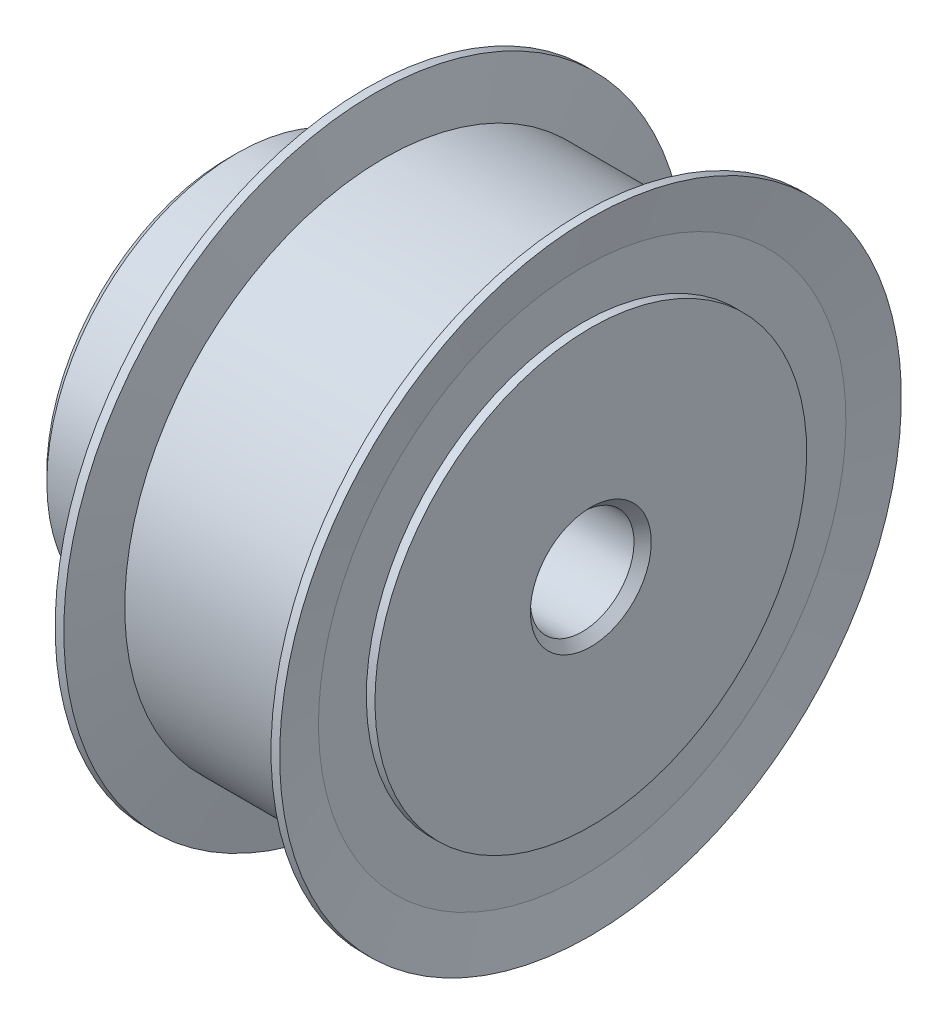
ISO-10303-21;
HEADER;
FILE_DESCRIPTION(('STEP AP214'),'2;1');
FILE_NAME('part.step','',(''),(''),'','','');
FILE_SCHEMA(('AUTOMOTIVE_DESIGN { 1 0 10303 214 1 1 1 1 }'));
ENDSEC;
DATA;
#1=APPLICATION_CONTEXT('core data for automotive mechanical design processes');
#2=APPLICATION_PROTOCOL_DEFINITION('international standard','automotive_design',2000,#1);
#3=PRODUCT_CONTEXT('',#1,'mechanical');
#4=PRODUCT('Part','Part','',(#3));
#5=PRODUCT_RELATED_PRODUCT_CATEGORY('part','',(#4));
#6=PRODUCT_DEFINITION_FORMATION('','',#4);
#7=PRODUCT_DEFINITION_CONTEXT('part definition',#1,'design');
#8=PRODUCT_DEFINITION('design','',#6,#7);
#9=PRODUCT_DEFINITION_SHAPE('','',#8);
#10=(LENGTH_UNIT() NAMED_UNIT(*) SI_UNIT(.MILLI.,.METRE.));
#11=(NAMED_UNIT(*) PLANE_ANGLE_UNIT() SI_UNIT($,.RADIAN.));
#12=(NAMED_UNIT(*) SI_UNIT($,.STERADIAN.) SOLID_ANGLE_UNIT());
#13=UNCERTAINTY_MEASURE_WITH_UNIT(LENGTH_MEASURE(1.E-05),#10,'distance_accuracy_value','');
#14=(GEOMETRIC_REPRESENTATION_CONTEXT(3) GLOBAL_UNCERTAINTY_ASSIGNED_CONTEXT((#13)) GLOBAL_UNIT_ASSIGNED_CONTEXT((#10,
#11,#12)) REPRESENTATION_CONTEXT('',''));
#15=CARTESIAN_POINT('',(0.,0.,0.));
#16=DIRECTION('',(0.,0.,1.));
#17=DIRECTION('',(1.,0.,0.));
#18=AXIS2_PLACEMENT_3D('',#15,#16,#17);
#19=CARTESIAN_POINT('',(21.,0.,0.));
#20=DIRECTION('',(1.,0.,0.));
#21=DIRECTION('',(0.,1.,0.));
#22=AXIS2_PLACEMENT_3D('',#19,#20,#21);
#23=CYLINDRICAL_SURFACE('',#22,11.);
#24=CARTESIAN_POINT('',(0.499999999999997,0.,0.));
#25=DIRECTION('',(-1.,0.,0.));
#26=DIRECTION('',(0.,-1.,0.));
#27=AXIS2_PLACEMENT_3D('',#24,#25,#26);
#28=CIRCLE('',#27,11.);
#29=CARTESIAN_POINT('',(0.499999999999997,-11.,0.));
#30=VERTEX_POINT('',#29);
#31=EDGE_CURVE('E10',#30,#30,#28,.F.);
#32=ORIENTED_EDGE('',*,*,#31,.T.);
#33=EDGE_LOOP('',(#32));
#34=FACE_BOUND('',#33,.T.);
#35=CARTESIAN_POINT('',(7.96237529878517,0.,0.));
#36=DIRECTION('',(1.,0.,0.));
#37=DIRECTION('',(0.,1.,0.));
#38=AXIS2_PLACEMENT_3D('',#35,#36,#37);
#39=CIRCLE('',#38,11.);
#40=CARTESIAN_POINT('',(7.96237529878517,11.,0.));
#41=VERTEX_POINT('',#40);
#42=EDGE_CURVE('E78',#41,#41,#39,.T.);
#43=ORIENTED_EDGE('',*,*,#42,.F.);
#44=EDGE_LOOP('',(#43));
#45=FACE_BOUND('',#44,.T.);
#46=ADVANCED_FACE('F45',(#34,#45),#23,.T.);
#47=CARTESIAN_POINT('',(7.96237529878517,12.5,0.));
#48=DIRECTION('',(-1.,0.,0.));
#49=DIRECTION('',(0.,-1.,0.));
#50=AXIS2_PLACEMENT_3D('',#47,#48,#49);
#51=PLANE('',#50);
#52=ORIENTED_EDGE('',*,*,#42,.T.);
#53=EDGE_LOOP('',(#52));
#54=FACE_BOUND('',#53,.T.);
#55=CARTESIAN_POINT('',(7.96237529878517,0.,0.));
#56=DIRECTION('',(1.,0.,0.));
#57=DIRECTION('',(0.,1.,0.));
#58=AXIS2_PLACEMENT_3D('',#55,#56,#57);
#59=CIRCLE('',#58,12.5);
#60=CARTESIAN_POINT('',(7.96237529878517,12.5,0.));
#61=VERTEX_POINT('',#60);
#62=EDGE_CURVE('E82',#61,#61,#59,.T.);
#63=ORIENTED_EDGE('',*,*,#62,.F.);
#64=EDGE_LOOP('',(#63));
#65=FACE_BOUND('',#64,.T.);
#66=ADVANCED_FACE('F149',(#54,#65),#51,.T.);
#67=CARTESIAN_POINT('',(21.,0.,0.));
#68=DIRECTION('',(1.,0.,0.));
#69=DIRECTION('',(0.,1.,0.));
#70=AXIS2_PLACEMENT_3D('',#67,#68,#69);
#71=CYLINDRICAL_SURFACE('',#70,12.5);
#72=ORIENTED_EDGE('',*,*,#62,.T.);
#73=EDGE_LOOP('',(#72));
#74=FACE_BOUND('',#73,.T.);
#75=CARTESIAN_POINT('',(8.46237529878517,0.,0.));
#76=DIRECTION('',(1.,0.,0.));
#77=DIRECTION('',(0.,1.,0.));
#78=AXIS2_PLACEMENT_3D('',#75,#76,#77);
#79=CIRCLE('',#78,12.5);
#80=CARTESIAN_POINT('',(8.46237529878517,12.5,0.));
#81=VERTEX_POINT('',#80);
#82=EDGE_CURVE('E86',#81,#81,#79,.T.);
#83=ORIENTED_EDGE('',*,*,#82,.F.);
#84=EDGE_LOOP('',(#83));
#85=FACE_BOUND('',#84,.T.);
#86=ADVANCED_FACE('F154',(#74,#85),#71,.T.);
#87=CARTESIAN_POINT('',(8.46237529878517,15.2710492321753,0.));
#88=DIRECTION('',(-1.,0.,0.));
#89=DIRECTION('',(0.,-1.,0.));
#90=AXIS2_PLACEMENT_3D('',#87,#88,#89);
#91=PLANE('',#90);
#92=ORIENTED_EDGE('',*,*,#82,.T.);
#93=EDGE_LOOP('',(#92));
#94=FACE_BOUND('',#93,.T.);
#95=CARTESIAN_POINT('',(8.46237529878517,0.,0.));
#96=DIRECTION('',(1.,0.,0.));
#97=DIRECTION('',(0.,1.,0.));
#98=AXIS2_PLACEMENT_3D('',#95,#96,#97);
#99=CIRCLE('',#98,15.2710492321753);
#100=CARTESIAN_POINT('',(8.46237529878517,15.2710492321753,0.));
#101=VERTEX_POINT('',#100);
#102=EDGE_CURVE('E90',#101,#101,#99,.T.);
#103=ORIENTED_EDGE('',*,*,#102,.F.);
#104=EDGE_LOOP('',(#103));
#105=FACE_BOUND('',#104,.T.);
#106=ADVANCED_FACE('F291',(#94,#105),#91,.T.);
#107=CARTESIAN_POINT('',(7.98118764939258,0.,0.));
#108=DIRECTION('',(-1.,0.,0.));
#109=DIRECTION('',(0.,-1.,0.));
#110=AXIS2_PLACEMENT_3D('',#107,#108,#109);
#111=CONICAL_SURFACE('',#110,18.,1.39626340159546);
#112=ORIENTED_EDGE('',*,*,#102,.T.);
#113=EDGE_LOOP('',(#112));
#114=FACE_BOUND('',#113,.T.);
#115=CARTESIAN_POINT('',(7.98118764939258,0.,0.));
#116=DIRECTION('',(1.,0.,0.));
#117=DIRECTION('',(0.,1.,0.));
#118=AXIS2_PLACEMENT_3D('',#115,#116,#117);
#119=CIRCLE('',#118,18.);
#120=CARTESIAN_POINT('',(7.98118764939258,18.,0.));
#121=VERTEX_POINT('',#120);
#122=EDGE_CURVE('E94',#121,#121,#119,.T.);
#123=ORIENTED_EDGE('',*,*,#122,.F.);
#124=EDGE_LOOP('',(#123));
#125=FACE_BOUND('',#124,.T.);
#126=ADVANCED_FACE('F282',(#114,#125),#111,.F.);
#127=CARTESIAN_POINT('',(21.,0.,0.));
#128=DIRECTION('',(1.,0.,0.));
#129=DIRECTION('',(0.,1.,0.));
#130=AXIS2_PLACEMENT_3D('',#127,#128,#129);
#131=CYLINDRICAL_SURFACE('',#130,18.);
#132=ORIENTED_EDGE('',*,*,#122,.T.);
#133=EDGE_LOOP('',(#132));
#134=FACE_BOUND('',#133,.T.);
#135=CARTESIAN_POINT('',(8.48118764939258,0.,0.));
#136=DIRECTION('',(1.,0.,0.));
#137=DIRECTION('',(0.,1.,0.));
#138=AXIS2_PLACEMENT_3D('',#135,#136,#137);
#139=CIRCLE('',#138,18.);
#140=CARTESIAN_POINT('',(8.48118764939258,18.,0.));
#141=VERTEX_POINT('',#140);
#142=EDGE_CURVE('E98',#141,#141,#139,.T.);
#143=ORIENTED_EDGE('',*,*,#142,.F.);
#144=EDGE_LOOP('',(#143));
#145=FACE_BOUND('',#144,.T.);
#146=ADVANCED_FACE('F273',(#134,#145),#131,.T.);
#147=CARTESIAN_POINT('',(9.01016859151798,0.,0.));
#148=DIRECTION('',(-1.,0.,0.));
#149=DIRECTION('',(0.,-1.,0.));
#150=AXIS2_PLACEMENT_3D('',#147,#148,#149);
#151=CONICAL_SURFACE('',#150,15.,1.39626340159546);
#152=ORIENTED_EDGE('',*,*,#142,.T.);
#153=EDGE_LOOP('',(#152));
#154=FACE_BOUND('',#153,.T.);
#155=CARTESIAN_POINT('',(9.01016859151798,0.,0.));
#156=DIRECTION('',(1.,0.,0.));
#157=DIRECTION('',(0.,1.,0.));
#158=AXIS2_PLACEMENT_3D('',#155,#156,#157);
#159=CIRCLE('',#158,15.);
#160=CARTESIAN_POINT('',(9.01016859151798,15.,0.));
#161=VERTEX_POINT('',#160);
#162=EDGE_CURVE('E102',#161,#161,#159,.T.);
#163=ORIENTED_EDGE('',*,*,#162,.F.);
#164=EDGE_LOOP('',(#163));
#165=FACE_BOUND('',#164,.T.);
#166=ADVANCED_FACE('F264',(#154,#165),#151,.T.);
#167=CARTESIAN_POINT('',(21.,0.,0.));
#168=DIRECTION('',(1.,0.,0.));
#169=DIRECTION('',(0.,1.,0.));
#170=AXIS2_PLACEMENT_3D('',#167,#168,#169);
#171=CYLINDRICAL_SURFACE('',#170,15.);
#172=ORIENTED_EDGE('',*,*,#162,.T.);
#173=EDGE_LOOP('',(#172));
#174=FACE_BOUND('',#173,.T.);
#175=CARTESIAN_POINT('',(19.9522067072672,0.,0.));
#176=DIRECTION('',(1.,0.,0.));
#177=DIRECTION('',(0.,1.,0.));
#178=AXIS2_PLACEMENT_3D('',#175,#176,#177);
#179=CIRCLE('',#178,15.);
#180=CARTESIAN_POINT('',(19.9522067072672,15.,0.));
#181=VERTEX_POINT('',#180);
#182=EDGE_CURVE('E106',#181,#181,#179,.T.);
#183=ORIENTED_EDGE('',*,*,#182,.F.);
#184=EDGE_LOOP('',(#183));
#185=FACE_BOUND('',#184,.T.);
#186=ADVANCED_FACE('F255',(#174,#185),#171,.T.);
#187=CARTESIAN_POINT('',(20.4811876493926,0.,0.));
#188=DIRECTION('',(1.,0.,0.));
#189=DIRECTION('',(0.,1.,0.));
#190=AXIS2_PLACEMENT_3D('',#187,#188,#189);
#191=CONICAL_SURFACE('',#190,18.,1.39626340159546);
#192=ORIENTED_EDGE('',*,*,#182,.T.);
#193=EDGE_LOOP('',(#192));
#194=FACE_BOUND('',#193,.T.);
#195=CARTESIAN_POINT('',(20.4811876493926,0.,0.));
#196=DIRECTION('',(1.,0.,0.));
#197=DIRECTION('',(0.,1.,0.));
#198=AXIS2_PLACEMENT_3D('',#195,#196,#197);
#199=CIRCLE('',#198,18.);
#200=CARTESIAN_POINT('',(20.4811876493926,18.,0.));
#201=VERTEX_POINT('',#200);
#202=EDGE_CURVE('E110',#201,#201,#199,.T.);
#203=ORIENTED_EDGE('',*,*,#202,.F.);
#204=EDGE_LOOP('',(#203));
#205=FACE_BOUND('',#204,.T.);
#206=ADVANCED_FACE('F246',(#194,#205),#191,.T.);
#207=CARTESIAN_POINT('',(21.,0.,0.));
#208=DIRECTION('',(1.,0.,0.));
#209=DIRECTION('',(0.,1.,0.));
#210=AXIS2_PLACEMENT_3D('',#207,#208,#209);
#211=CYLINDRICAL_SURFACE('',#210,18.);
#212=ORIENTED_EDGE('',*,*,#202,.T.);
#213=EDGE_LOOP('',(#212));
#214=FACE_BOUND('',#213,.T.);
#215=CARTESIAN_POINT('',(20.9811876493926,0.,0.));
#216=DIRECTION('',(1.,0.,0.));
#217=DIRECTION('',(0.,1.,0.));
#218=AXIS2_PLACEMENT_3D('',#215,#216,#217);
#219=CIRCLE('',#218,18.);
#220=CARTESIAN_POINT('',(20.9811876493926,18.,0.));
#221=VERTEX_POINT('',#220);
#222=EDGE_CURVE('E114',#221,#221,#219,.T.);
#223=ORIENTED_EDGE('',*,*,#222,.F.);
#224=EDGE_LOOP('',(#223));
#225=FACE_BOUND('',#224,.T.);
#226=ADVANCED_FACE('F237',(#214,#225),#211,.T.);
#227=CARTESIAN_POINT('',(20.5,0.,0.));
#228=DIRECTION('',(1.,0.,0.));
#229=DIRECTION('',(0.,1.,0.));
#230=AXIS2_PLACEMENT_3D('',#227,#228,#229);
#231=CONICAL_SURFACE('',#230,15.2710492321753,1.39626340159546);
#232=ORIENTED_EDGE('',*,*,#222,.T.);
#233=EDGE_LOOP('',(#232));
#234=FACE_BOUND('',#233,.T.);
#235=CARTESIAN_POINT('',(20.5,0.,0.));
#236=DIRECTION('',(1.,0.,0.));
#237=DIRECTION('',(0.,1.,0.));
#238=AXIS2_PLACEMENT_3D('',#235,#236,#237);
#239=CIRCLE('',#238,15.2710492321753);
#240=CARTESIAN_POINT('',(20.5,15.2710492321753,0.));
#241=VERTEX_POINT('',#240);
#242=EDGE_CURVE('E118',#241,#241,#239,.T.);
#243=ORIENTED_EDGE('',*,*,#242,.F.);
#244=EDGE_LOOP('',(#243));
#245=FACE_BOUND('',#244,.T.);
#246=ADVANCED_FACE('F146',(#234,#245),#231,.F.);
#247=CARTESIAN_POINT('',(20.5,15.2710492321753,0.));
#248=DIRECTION('',(1.,0.,0.));
#249=DIRECTION('',(0.,1.,0.));
#250=AXIS2_PLACEMENT_3D('',#247,#248,#249);
#251=PLANE('',#250);
#252=ORIENTED_EDGE('',*,*,#242,.T.);
#253=EDGE_LOOP('',(#252));
#254=FACE_BOUND('',#253,.T.);
#255=CARTESIAN_POINT('',(20.5,0.,0.));
#256=DIRECTION('',(1.,0.,0.));
#257=DIRECTION('',(0.,1.,0.));
#258=AXIS2_PLACEMENT_3D('',#255,#256,#257);
#259=CIRCLE('',#258,12.5);
#260=CARTESIAN_POINT('',(20.5,12.5,0.));
#261=VERTEX_POINT('',#260);
#262=EDGE_CURVE('E122',#261,#261,#259,.T.);
#263=ORIENTED_EDGE('',*,*,#262,.F.);
#264=EDGE_LOOP('',(#263));
#265=FACE_BOUND('',#264,.T.);
#266=ADVANCED_FACE('F135',(#254,#265),#251,.T.);
#267=CARTESIAN_POINT('',(21.,0.,0.));
#268=DIRECTION('',(1.,0.,0.));
#269=DIRECTION('',(0.,1.,0.));
#270=AXIS2_PLACEMENT_3D('',#267,#268,#269);
#271=CYLINDRICAL_SURFACE('',#270,12.5);
#272=ORIENTED_EDGE('',*,*,#262,.T.);
#273=EDGE_LOOP('',(#272));
#274=FACE_BOUND('',#273,.T.);
#275=CARTESIAN_POINT('',(21.,0.,0.));
#276=DIRECTION('',(1.,0.,0.));
#277=DIRECTION('',(0.,1.,0.));
#278=AXIS2_PLACEMENT_3D('',#275,#276,#277);
#279=CIRCLE('',#278,12.5);
#280=CARTESIAN_POINT('',(21.,12.5,0.));
#281=VERTEX_POINT('',#280);
#282=EDGE_CURVE('E126',#281,#281,#279,.T.);
#283=ORIENTED_EDGE('',*,*,#282,.F.);
#284=EDGE_LOOP('',(#283));
#285=FACE_BOUND('',#284,.T.);
#286=ADVANCED_FACE('F133',(#274,#285),#271,.T.);
#287=CARTESIAN_POINT('',(21.,12.5,0.));
#288=DIRECTION('',(1.,0.,0.));
#289=DIRECTION('',(0.,1.,0.));
#290=AXIS2_PLACEMENT_3D('',#287,#288,#289);
#291=PLANE('',#290);
#292=CARTESIAN_POINT('',(21.,0.,0.));
#293=DIRECTION('',(1.,0.,0.));
#294=DIRECTION('',(0.,1.,0.));
#295=AXIS2_PLACEMENT_3D('',#292,#293,#294);
#296=CIRCLE('',#295,3.50000000000001);
#297=CARTESIAN_POINT('',(21.,3.50000000000001,0.));
#298=VERTEX_POINT('',#297);
#299=EDGE_CURVE('E64',#298,#298,#296,.F.);
#300=ORIENTED_EDGE('',*,*,#299,.T.);
#301=EDGE_LOOP('',(#300));
#302=FACE_BOUND('',#301,.T.);
#303=ORIENTED_EDGE('',*,*,#282,.T.);
#304=EDGE_LOOP('',(#303));
#305=FACE_BOUND('',#304,.T.);
#306=ADVANCED_FACE('F131',(#302,#305),#291,.T.);
#307=CARTESIAN_POINT('',(21.,0.,0.));
#308=DIRECTION('',(1.,0.,0.));
#309=DIRECTION('',(0.,1.,0.));
#310=AXIS2_PLACEMENT_3D('',#307,#308,#309);
#311=CYLINDRICAL_SURFACE('',#310,3.);
#312=CARTESIAN_POINT('',(20.5,0.,0.));
#313=DIRECTION('',(1.,0.,0.));
#314=DIRECTION('',(0.,1.,0.));
#315=AXIS2_PLACEMENT_3D('',#312,#313,#314);
#316=CIRCLE('',#315,3.);
#317=CARTESIAN_POINT('',(20.5,3.,0.));
#318=VERTEX_POINT('',#317);
#319=EDGE_CURVE('E70',#318,#318,#316,.T.);
#320=ORIENTED_EDGE('',*,*,#319,.T.);
#321=EDGE_LOOP('',(#320));
#322=FACE_BOUND('',#321,.T.);
#323=CARTESIAN_POINT('',(0.500000000000004,0.,0.));
#324=DIRECTION('',(-1.,0.,0.));
#325=DIRECTION('',(0.,-1.,0.));
#326=AXIS2_PLACEMENT_3D('',#323,#324,#325);
#327=CIRCLE('',#326,3.);
#328=CARTESIAN_POINT('',(0.500000000000004,-3.,0.));
#329=VERTEX_POINT('',#328);
#330=EDGE_CURVE('E74',#329,#329,#327,.T.);
#331=ORIENTED_EDGE('',*,*,#330,.T.);
#332=EDGE_LOOP('',(#331));
#333=FACE_BOUND('',#332,.T.);
#334=ADVANCED_FACE('F143',(#322,#333),#311,.F.);
#335=CARTESIAN_POINT('',(0.,3.,0.));
#336=DIRECTION('',(-1.,0.,0.));
#337=DIRECTION('',(0.,-1.,0.));
#338=AXIS2_PLACEMENT_3D('',#335,#336,#337);
#339=PLANE('',#338);
#340=CARTESIAN_POINT('',(0.,0.,0.));
#341=DIRECTION('',(-1.,0.,0.));
#342=DIRECTION('',(0.,-1.,0.));
#343=AXIS2_PLACEMENT_3D('',#340,#341,#342);
#344=CIRCLE('',#343,3.5);
#345=CARTESIAN_POINT('',(0.,-3.5,0.));
#346=VERTEX_POINT('',#345);
#347=EDGE_CURVE('E54',#346,#346,#344,.F.);
#348=ORIENTED_EDGE('',*,*,#347,.T.);
#349=EDGE_LOOP('',(#348));
#350=FACE_BOUND('',#349,.T.);
#351=CARTESIAN_POINT('',(0.,0.,0.));
#352=DIRECTION('',(-1.,0.,0.));
#353=DIRECTION('',(0.,-1.,0.));
#354=AXIS2_PLACEMENT_3D('',#351,#352,#353);
#355=CIRCLE('',#354,10.5);
#356=CARTESIAN_POINT('',(0.,-10.5,0.));
#357=VERTEX_POINT('',#356);
#358=EDGE_CURVE('E59',#357,#357,#355,.T.);
#359=ORIENTED_EDGE('',*,*,#358,.T.);
#360=EDGE_LOOP('',(#359));
#361=FACE_BOUND('',#360,.T.);
#362=ADVANCED_FACE('F167',(#350,#361),#339,.T.);
#363=CARTESIAN_POINT('',(20.5,0.,0.));
#364=DIRECTION('',(1.,0.,0.));
#365=DIRECTION('',(0.,1.,0.));
#366=AXIS2_PLACEMENT_3D('',#363,#364,#365);
#367=CONICAL_SURFACE('',#366,3.,0.785398163397453);
#368=ORIENTED_EDGE('',*,*,#299,.F.);
#369=EDGE_LOOP('',(#368));
#370=FACE_BOUND('',#369,.T.);
#371=ORIENTED_EDGE('',*,*,#319,.F.);
#372=EDGE_LOOP('',(#371));
#373=FACE_BOUND('',#372,.T.);
#374=ADVANCED_FACE('F161',(#370,#373),#367,.F.);
#375=CARTESIAN_POINT('',(0.,0.,0.));
#376=DIRECTION('',(-1.,0.,0.));
#377=DIRECTION('',(0.,-1.,0.));
#378=AXIS2_PLACEMENT_3D('',#375,#376,#377);
#379=CONICAL_SURFACE('',#378,3.5,0.78539816339745);
#380=ORIENTED_EDGE('',*,*,#330,.F.);
#381=EDGE_LOOP('',(#380));
#382=FACE_BOUND('',#381,.T.);
#383=ORIENTED_EDGE('',*,*,#347,.F.);
#384=EDGE_LOOP('',(#383));
#385=FACE_BOUND('',#384,.T.);
#386=ADVANCED_FACE('F166',(#382,#385),#379,.F.);
#387=CARTESIAN_POINT('',(0.499999999999997,0.,0.));
#388=DIRECTION('',(1.,0.,0.));
#389=DIRECTION('',(0.,1.,0.));
#390=AXIS2_PLACEMENT_3D('',#387,#388,#389);
#391=CONICAL_SURFACE('',#390,11.,0.785398163397455);
#392=ORIENTED_EDGE('',*,*,#358,.F.);
#393=EDGE_LOOP('',(#392));
#394=FACE_BOUND('',#393,.T.);
#395=ORIENTED_EDGE('',*,*,#31,.F.);
#396=EDGE_LOOP('',(#395));
#397=FACE_BOUND('',#396,.T.);
#398=ADVANCED_FACE('F48',(#394,#397),#391,.T.);
#399=CLOSED_SHELL('',(#46,#66,#86,#106,#126,#146,#166,#186,#206,#226,#246,#266,#286,#306,#334,
#362,#374,#386,#398));
#400=MANIFOLD_SOLID_BREP('B2',#399);
#401=ADVANCED_BREP_SHAPE_REPRESENTATION('',(#18,#400),#14);
#402=SHAPE_DEFINITION_REPRESENTATION(#9,#401);
ENDSEC;
END-ISO-10303-21;
